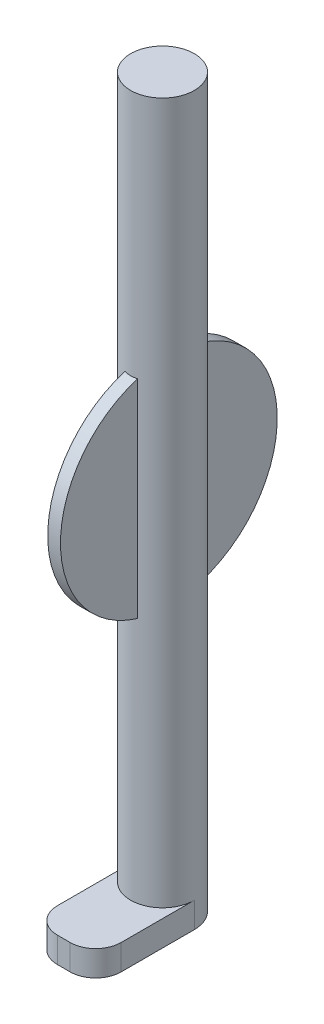
ISO-10303-21;
HEADER;
FILE_DESCRIPTION(('STEP AP214'),'2;1');
FILE_NAME('part.step','',(''),(''),'','','');
FILE_SCHEMA(('AUTOMOTIVE_DESIGN { 1 0 10303 214 1 1 1 1 }'));
ENDSEC;
DATA;
#1=APPLICATION_CONTEXT('core data for automotive mechanical design processes');
#2=APPLICATION_PROTOCOL_DEFINITION('international standard','automotive_design',2000,#1);
#3=PRODUCT_CONTEXT('',#1,'mechanical');
#4=PRODUCT('Part','Part','',(#3));
#5=PRODUCT_RELATED_PRODUCT_CATEGORY('part','',(#4));
#6=PRODUCT_DEFINITION_FORMATION('','',#4);
#7=PRODUCT_DEFINITION_CONTEXT('part definition',#1,'design');
#8=PRODUCT_DEFINITION('design','',#6,#7);
#9=PRODUCT_DEFINITION_SHAPE('','',#8);
#10=(LENGTH_UNIT() NAMED_UNIT(*) SI_UNIT(.MILLI.,.METRE.));
#11=(NAMED_UNIT(*) PLANE_ANGLE_UNIT() SI_UNIT($,.RADIAN.));
#12=(NAMED_UNIT(*) SI_UNIT($,.STERADIAN.) SOLID_ANGLE_UNIT());
#13=UNCERTAINTY_MEASURE_WITH_UNIT(LENGTH_MEASURE(1.E-05),#10,'distance_accuracy_value','');
#14=(GEOMETRIC_REPRESENTATION_CONTEXT(3) GLOBAL_UNCERTAINTY_ASSIGNED_CONTEXT((#13)) GLOBAL_UNIT_ASSIGNED_CONTEXT((#10,
#11,#12)) REPRESENTATION_CONTEXT('',''));
#15=CARTESIAN_POINT('',(0.,0.,0.));
#16=DIRECTION('',(0.,0.,1.));
#17=DIRECTION('',(1.,0.,0.));
#18=AXIS2_PLACEMENT_3D('',#15,#16,#17);
#19=CARTESIAN_POINT('',(0.,55.,0.));
#20=DIRECTION('',(0.,-1.,0.));
#21=DIRECTION('',(0.,0.,-1.));
#22=AXIS2_PLACEMENT_3D('',#19,#20,#21);
#23=CYLINDRICAL_SURFACE('',#22,2.5);
#24=DIRECTION('',(0.,-1.,0.));
#25=VECTOR('',#24,1.);
#26=CARTESIAN_POINT('',(-0.5,55.,-2.44948974278318));
#27=LINE('',#26,#25);
#28=CARTESIAN_POINT('',(-0.5,19.3605897019501,-2.44948974278318));
#29=VERTEX_POINT('',#28);
#30=CARTESIAN_POINT('',(-0.5,35.6394102980499,-2.44948974278318));
#31=VERTEX_POINT('',#30);
#32=EDGE_CURVE('E213',#29,#31,#27,.F.);
#33=ORIENTED_EDGE('',*,*,#32,.F.);
#34=CARTESIAN_POINT('',(0.,19.375961595364,-2.5));
#35=CARTESIAN_POINT('',(0.137126147164807,19.3759599523077,-2.49999796236332));
#36=CARTESIAN_POINT('',(0.2742725772205,19.3724517650998,-2.48867946345813));
#37=CARTESIAN_POINT('',(0.544564816931385,19.3588514629897,-2.44381537502387));
#38=CARTESIAN_POINT('',(0.677709151405955,19.3487569507454,-2.41026169208832));
#39=CARTESIAN_POINT('',(0.936045836237619,19.3232240271243,-2.32215786618519));
#40=CARTESIAN_POINT('',(1.06125065146262,19.3077942508059,-2.26764163496267));
#41=CARTESIAN_POINT('',(1.30076603295632,19.2733409037312,-2.13927079722776));
#42=CARTESIAN_POINT('',(1.41507510430714,19.2543168408963,-2.06541354228249));
#43=CARTESIAN_POINT('',(1.63303109178047,19.2141695567546,-1.89805242493169));
#44=CARTESIAN_POINT('',(1.736297582944,19.1930029477946,-1.80406342823792));
#45=CARTESIAN_POINT('',(1.92585344481319,19.151326842127,-1.60014717785515));
#46=CARTESIAN_POINT('',(2.01214071585728,19.1308174269504,-1.49021795590314));
#47=CARTESIAN_POINT('',(2.16692855677449,19.0922753130273,-1.25484804530034));
#48=CARTESIAN_POINT('',(2.23504302331761,19.0742997090688,-1.12914327438481));
#49=CARTESIAN_POINT('',(2.34901988239022,19.0433535128481,-0.867445637031227));
#50=CARTESIAN_POINT('',(2.39488687848409,19.0303818852505,-0.731454905756561));
#51=CARTESIAN_POINT('',(2.46181297512718,19.0112121482865,-0.45702400583845));
#52=CARTESIAN_POINT('',(2.48352102784736,19.0048371902868,-0.318754673888341));
#53=CARTESIAN_POINT('',(2.50356312611636,18.9989571048612,-0.0403993943316255));
#54=CARTESIAN_POINT('',(2.50190189675216,18.9994505886894,0.0996861803221896));
#55=CARTESIAN_POINT('',(2.47569214141496,19.0071259307158,0.373151342435312));
#56=CARTESIAN_POINT('',(2.45184606102945,19.0141025051135,0.506604918733647));
#57=CARTESIAN_POINT('',(2.38308861809746,19.0337119911165,0.767524842762461));
#58=CARTESIAN_POINT('',(2.3381759421864,19.0463452553773,0.894990816659903));
#59=CARTESIAN_POINT('',(2.22807324939298,19.0761362193064,1.14200961129054));
#60=CARTESIAN_POINT('',(2.16265872076083,19.0933436768076,1.26145611323968));
#61=CARTESIAN_POINT('',(2.01358574381612,19.1304524070814,1.48790420805442));
#62=CARTESIAN_POINT('',(1.92992310290204,19.1503542985153,1.59490293229939));
#63=CARTESIAN_POINT('',(1.74306936032478,19.1915886776925,1.79761108283251));
#64=CARTESIAN_POINT('',(1.63926876644528,19.212946846908,1.89275419933163));
#65=CARTESIAN_POINT('',(1.41697443540832,19.2540370182653,2.06443893360174));
#66=CARTESIAN_POINT('',(1.29847935501809,19.2737688714697,2.14097884894606));
#67=CARTESIAN_POINT('',(1.04871784710496,19.309491683028,2.27384467334688));
#68=CARTESIAN_POINT('',(0.91734712527496,19.3254477785804,2.32998458403206));
#69=CARTESIAN_POINT('',(0.646439497138881,19.3513960138771,2.41918075403472));
#70=CARTESIAN_POINT('',(0.506905148346237,19.3613900105671,2.45224420125603));
#71=CARTESIAN_POINT('',(0.229004007824919,19.373877085009,2.49330571013838));
#72=CARTESIAN_POINT('',(0.0907753960252166,19.3766267660525,2.50216167789634));
#73=CARTESIAN_POINT('',(-0.185194778369791,19.3750220862801,2.49694674077672));
#74=CARTESIAN_POINT('',(-0.322936403542723,19.370668674122,2.48287889750257));
#75=CARTESIAN_POINT('',(-0.590495744732526,19.3555994684947,2.43297838264223));
#76=CARTESIAN_POINT('',(-0.720425118724463,19.3450433190186,2.39769132906183));
#77=CARTESIAN_POINT('',(-0.972512602256212,19.3189217231529,2.30698314161101));
#78=CARTESIAN_POINT('',(-1.09466954084263,19.3033555241063,2.25155898239259));
#79=CARTESIAN_POINT('',(-1.33125222631923,19.2684648313811,2.12050182351162));
#80=CARTESIAN_POINT('',(-1.44539473754603,19.2490532188177,2.04438129566145));
#81=CARTESIAN_POINT('',(-1.65959995624599,19.2088492104373,1.87467572806313));
#82=CARTESIAN_POINT('',(-1.75965941696733,19.188056497838,1.78108667259488));
#83=CARTESIAN_POINT('',(-1.94657515707877,19.1465253194381,1.57507916378059));
#84=CARTESIAN_POINT('',(-2.03282496206256,19.1258158666673,1.46210326579578));
#85=CARTESIAN_POINT('',(-2.18515281989699,19.0875425224091,1.22279215701974));
#86=CARTESIAN_POINT('',(-2.25123190054355,19.0699784706673,1.0964576273572));
#87=CARTESIAN_POINT('',(-2.36070652456102,19.0400844051619,0.834869700798008));
#88=CARTESIAN_POINT('',(-2.40427287272618,19.0277151170737,0.699692499333716));
#89=CARTESIAN_POINT('',(-2.46793605303548,19.0094307649756,0.423508369003449));
#90=CARTESIAN_POINT('',(-2.48803931580861,19.0035139325427,0.282503048450325));
#91=CARTESIAN_POINT('',(-2.50373214990651,18.9989044200641,0.00428063265452654));
#92=CARTESIAN_POINT('',(-2.50020294498525,18.9999520341367,-0.132883087997761));
#93=CARTESIAN_POINT('',(-2.47082648153114,19.0085461617359,-0.404579879027505));
#94=CARTESIAN_POINT('',(-2.4449804049082,19.0160923310966,-0.539113088331973));
#95=CARTESIAN_POINT('',(-2.37224139343081,19.0367655647524,-0.8004300620716));
#96=CARTESIAN_POINT('',(-2.325560861568,19.0498362383085,-0.92727771497263));
#97=CARTESIAN_POINT('',(-2.21266745409868,19.0802047738536,-1.17140848295971));
#98=CARTESIAN_POINT('',(-2.1464514420796,19.0975033145483,-1.28869005835388));
#99=CARTESIAN_POINT('',(-1.9939784527005,19.1351726493757,-1.51431862183009));
#100=CARTESIAN_POINT('',(-1.90716266730101,19.1556222064547,-1.6222747375242));
#101=CARTESIAN_POINT('',(-1.71697053423111,19.1970254073248,-1.8223817825515));
#102=CARTESIAN_POINT('',(-1.61358949922716,19.2179791923626,-1.91452822302222));
#103=CARTESIAN_POINT('',(-1.38968670721729,19.2587142479691,-2.08301441277003));
#104=CARTESIAN_POINT('',(-1.26876250993104,19.2784455223777,-2.1588327454279));
#105=CARTESIAN_POINT('',(-1.01532212732722,19.313719683219,-2.28897091376096));
#106=CARTESIAN_POINT('',(-0.882811943832912,19.3292647213946,-2.34330180082886));
#107=CARTESIAN_POINT('',(-0.626106943864921,19.3527519151368,-2.42360986971079));
#108=CARTESIAN_POINT('',(-0.502780757797447,19.3613755778767,-2.45217950771625));
#109=CARTESIAN_POINT('',(-0.252975082965178,19.372980663096,-2.49037379107052));
#110=CARTESIAN_POINT('',(-0.126496171547739,19.3759631110511,-2.50000187967973));
#111=CARTESIAN_POINT('',(0.,19.375961595364,-2.5));
#112=B_SPLINE_CURVE_WITH_KNOTS('',3,(#34,#35,#36,#37,#38,#39,#40,#41,#42,#43,#44,#45,#46,#47,
#48,#49,#50,#51,#52,#53,#54,#55,#56,#57,#58,#59,#60,#61,#62,#63,#64,#65,#66,#67,#68,#69,#70,#71,
#72,#73,#74,#75,#76,#77,#78,#79,#80,#81,#82,#83,#84,#85,#86,#87,#88,#89,#90,#91,#92,#93,#94,#95,
#96,#97,#98,#99,#100,#101,#102,#103,#104,#105,#106,#107,#108,#109,#110,#111),.UNSPECIFIED.,.T.,
.F.,(4,2,2,2,2,2,2,2,2,2,2,2,2,2,2,2,2,2,2,2,2,2,2,2,2,2,2,2,2,2,2,2,2,2,2,2,2,2,4),(0.,
0.410912099878095,0.821973850269873,1.23237339254286,1.64282916164919,2.06459109250964,
2.48640514599761,2.91657307890349,3.34665196116877,3.76487622839166,4.1830159351379,
4.58835076674874,4.99371087169739,5.40367496479819,5.81373334874934,6.23900922160109,
6.66432399789825,7.09342468655064,7.52239165832584,7.93594602558847,8.34944516487446,
8.75274111013304,9.15609767062928,9.56993137756289,9.98386033532175,10.4127208011549,
10.8415594108246,11.2670947877504,11.6925135089525,12.1021596149396,12.5117840272457,
12.9173245470081,13.3229302115836,13.7411394840136,14.1594673033652,14.5896395325794,
15.0195902276005,15.3987174767159,15.7777758003975),.UNSPECIFIED.);
#113=CARTESIAN_POINT('',(0.5,19.3605897019501,-2.44948974278318));
#114=VERTEX_POINT('',#113);
#115=EDGE_CURVE('E170',#29,#114,#112,.T.);
#116=ORIENTED_EDGE('',*,*,#115,.T.);
#117=DIRECTION('',(0.,-1.,0.));
#118=VECTOR('',#117,1.);
#119=CARTESIAN_POINT('',(0.5,55.,-2.44948974278318));
#120=LINE('',#119,#118);
#121=CARTESIAN_POINT('',(0.5,35.6394102980499,-2.44948974278318));
#122=VERTEX_POINT('',#121);
#123=EDGE_CURVE('E164',#114,#122,#120,.F.);
#124=ORIENTED_EDGE('',*,*,#123,.T.);
#125=CARTESIAN_POINT('',(0.,35.624038404636,-2.5));
#126=CARTESIAN_POINT('',(-0.137126147164807,35.6240400476923,-2.49999796236332));
#127=CARTESIAN_POINT('',(-0.2742725772205,35.6275482349002,-2.48867946345813));
#128=CARTESIAN_POINT('',(-0.544564816931385,35.6411485370103,-2.44381537502387));
#129=CARTESIAN_POINT('',(-0.677709151405954,35.6512430492546,-2.41026169208832));
#130=CARTESIAN_POINT('',(-0.936045836237619,35.6767759728757,-2.32215786618519));
#131=CARTESIAN_POINT('',(-1.06125065146262,35.6922057491941,-2.26764163496267));
#132=CARTESIAN_POINT('',(-1.30076603295632,35.7266590962688,-2.13927079722776));
#133=CARTESIAN_POINT('',(-1.41507510430714,35.7456831591037,-2.06541354228249));
#134=CARTESIAN_POINT('',(-1.63303109178047,35.7858304432455,-1.89805242493169));
#135=CARTESIAN_POINT('',(-1.736297582944,35.8069970522054,-1.80406342823792));
#136=CARTESIAN_POINT('',(-1.92585344481319,35.848673157873,-1.60014717785515));
#137=CARTESIAN_POINT('',(-2.01214071585728,35.8691825730496,-1.49021795590314));
#138=CARTESIAN_POINT('',(-2.16692855677449,35.9077246869727,-1.25484804530034));
#139=CARTESIAN_POINT('',(-2.23504302331761,35.9257002909312,-1.12914327438482));
#140=CARTESIAN_POINT('',(-2.34901988239022,35.9566464871519,-0.867445637031227));
#141=CARTESIAN_POINT('',(-2.39488687848409,35.9696181147495,-0.731454905756561));
#142=CARTESIAN_POINT('',(-2.46181297512718,35.9887878517135,-0.45702400583845));
#143=CARTESIAN_POINT('',(-2.48352102784736,35.9951628097132,-0.31875467388834));
#144=CARTESIAN_POINT('',(-2.50356312611636,36.0010428951388,-0.0403993943316249));
#145=CARTESIAN_POINT('',(-2.50190189675216,36.0005494113106,0.0996861803221902));
#146=CARTESIAN_POINT('',(-2.47569214141496,35.9928740692842,0.373151342435312));
#147=CARTESIAN_POINT('',(-2.45184606102944,35.9858974948865,0.506604918733647));
#148=CARTESIAN_POINT('',(-2.38308861809746,35.9662880088835,0.767524842762461));
#149=CARTESIAN_POINT('',(-2.3381759421864,35.9536547446227,0.894990816659903));
#150=CARTESIAN_POINT('',(-2.22807324939298,35.9238637806936,1.14200961129054));
#151=CARTESIAN_POINT('',(-2.16265872076083,35.9066563231924,1.26145611323968));
#152=CARTESIAN_POINT('',(-2.01358574381612,35.8695475929186,1.48790420805442));
#153=CARTESIAN_POINT('',(-1.92992310290204,35.8496457014847,1.59490293229939));
#154=CARTESIAN_POINT('',(-1.74306936032478,35.8084113223075,1.79761108283251));
#155=CARTESIAN_POINT('',(-1.63926876644528,35.787053153092,1.89275419933163));
#156=CARTESIAN_POINT('',(-1.41697443540832,35.7459629817347,2.06443893360174));
#157=CARTESIAN_POINT('',(-1.29847935501809,35.7262311285303,2.14097884894606));
#158=CARTESIAN_POINT('',(-1.04871784710496,35.690508316972,2.27384467334688));
#159=CARTESIAN_POINT('',(-0.917347125274959,35.6745522214196,2.32998458403206));
#160=CARTESIAN_POINT('',(-0.64643949713888,35.6486039861229,2.41918075403472));
#161=CARTESIAN_POINT('',(-0.506905148346235,35.6386099894329,2.45224420125603));
#162=CARTESIAN_POINT('',(-0.229004007824918,35.626122914991,2.49330571013838));
#163=CARTESIAN_POINT('',(-0.0907753960252156,35.6233732339475,2.50216167789634));
#164=CARTESIAN_POINT('',(0.185194778369792,35.6249779137199,2.49694674077672));
#165=CARTESIAN_POINT('',(0.322936403542724,35.629331325878,2.48287889750257));
#166=CARTESIAN_POINT('',(0.590495744732527,35.6444005315053,2.43297838264223));
#167=CARTESIAN_POINT('',(0.720425118724463,35.6549566809814,2.39769132906183));
#168=CARTESIAN_POINT('',(0.972512602256212,35.6810782768471,2.30698314161101));
#169=CARTESIAN_POINT('',(1.09466954084263,35.6966444758936,2.25155898239259));
#170=CARTESIAN_POINT('',(1.33125222631923,35.7315351686189,2.12050182351162));
#171=CARTESIAN_POINT('',(1.44539473754603,35.7509467811823,2.04438129566145));
#172=CARTESIAN_POINT('',(1.65959995624599,35.7911507895627,1.87467572806313));
#173=CARTESIAN_POINT('',(1.75965941696733,35.811943502162,1.78108667259488));
#174=CARTESIAN_POINT('',(1.94657515707877,35.8534746805619,1.57507916378059));
#175=CARTESIAN_POINT('',(2.03282496206256,35.8741841333327,1.46210326579578));
#176=CARTESIAN_POINT('',(2.18515281989699,35.9124574775909,1.22279215701974));
#177=CARTESIAN_POINT('',(2.25123190054355,35.9300215293327,1.0964576273572));
#178=CARTESIAN_POINT('',(2.36070652456102,35.9599155948381,0.834869700798008));
#179=CARTESIAN_POINT('',(2.40427287272618,35.9722848829264,0.699692499333716));
#180=CARTESIAN_POINT('',(2.46793605303548,35.9905692350244,0.423508369003448));
#181=CARTESIAN_POINT('',(2.48803931580861,35.9964860674573,0.282503048450324));
#182=CARTESIAN_POINT('',(2.50373214990651,36.0010955799359,0.00428063265452513));
#183=CARTESIAN_POINT('',(2.50020294498525,36.0000479658633,-0.132883087997763));
#184=CARTESIAN_POINT('',(2.47082648153114,35.9914538382641,-0.404579879027507));
#185=CARTESIAN_POINT('',(2.4449804049082,35.9839076689034,-0.539113088331975));
#186=CARTESIAN_POINT('',(2.37224139343081,35.9632344352476,-0.800430062071602));
#187=CARTESIAN_POINT('',(2.325560861568,35.9501637616915,-0.927277714972633));
#188=CARTESIAN_POINT('',(2.21266745409868,35.9197952261463,-1.17140848295972));
#189=CARTESIAN_POINT('',(2.1464514420796,35.9024966854517,-1.28869005835389));
#190=CARTESIAN_POINT('',(1.9939784527005,35.8648273506244,-1.51431862183009));
#191=CARTESIAN_POINT('',(1.90716266730101,35.8443777935453,-1.6222747375242));
#192=CARTESIAN_POINT('',(1.71697053423111,35.8029745926752,-1.82238178255151));
#193=CARTESIAN_POINT('',(1.61358949922716,35.7820208076374,-1.91452822302223));
#194=CARTESIAN_POINT('',(1.38968670721729,35.7412857520309,-2.08301441277003));
#195=CARTESIAN_POINT('',(1.26876250993104,35.7215544776223,-2.1588327454279));
#196=CARTESIAN_POINT('',(1.01532212732722,35.686280316781,-2.28897091376096));
#197=CARTESIAN_POINT('',(0.882811943832911,35.6707352786054,-2.34330180082887));
#198=CARTESIAN_POINT('',(0.626106943864921,35.6472480848632,-2.42360986971079));
#199=CARTESIAN_POINT('',(0.502780757797447,35.6386244221233,-2.45217950771625));
#200=CARTESIAN_POINT('',(0.252975082965179,35.627019336904,-2.49037379107052));
#201=CARTESIAN_POINT('',(0.126496171547739,35.6240368889489,-2.50000187967973));
#202=CARTESIAN_POINT('',(0.,35.624038404636,-2.5));
#203=B_SPLINE_CURVE_WITH_KNOTS('',3,(#125,#126,#127,#128,#129,#130,#131,#132,#133,#134,#135,
#136,#137,#138,#139,#140,#141,#142,#143,#144,#145,#146,#147,#148,#149,#150,#151,#152,#153,#154,
#155,#156,#157,#158,#159,#160,#161,#162,#163,#164,#165,#166,#167,#168,#169,#170,#171,#172,#173,
#174,#175,#176,#177,#178,#179,#180,#181,#182,#183,#184,#185,#186,#187,#188,#189,#190,#191,#192,
#193,#194,#195,#196,#197,#198,#199,#200,#201,#202),.UNSPECIFIED.,.T.,.F.,(4,2,2,2,2,2,2,2,2,2,2,
2,2,2,2,2,2,2,2,2,2,2,2,2,2,2,2,2,2,2,2,2,2,2,2,2,2,2,4),(0.,0.410912099878095,
0.821973850269873,1.23237339254286,1.64282916164919,2.06459109250964,2.48640514599761,
2.91657307890349,3.34665196116877,3.76487622839166,4.1830159351379,4.58835076674874,
4.99371087169739,5.40367496479819,5.81373334874934,6.23900922160109,6.66432399789825,
7.09342468655064,7.52239165832584,7.93594602558847,8.34944516487446,8.75274111013304,
9.15609767062928,9.56993137756289,9.98386033532175,10.4127208011549,10.8415594108246,
11.2670947877504,11.6925135089525,12.1021596149396,12.5117840272457,12.9173245470081,
13.3229302115836,13.7411394840136,14.1594673033652,14.5896395325794,15.0195902276005,
15.3987174767158,15.7777758003975),.UNSPECIFIED.);
#204=EDGE_CURVE('E179',#122,#31,#203,.T.);
#205=ORIENTED_EDGE('',*,*,#204,.T.);
#206=EDGE_LOOP('',(#33,#116,#124,#205));
#207=FACE_BOUND('',#206,.T.);
#208=CARTESIAN_POINT('',(0.,55.,0.));
#209=DIRECTION('',(0.,1.,0.));
#210=DIRECTION('',(0.,0.,1.));
#211=AXIS2_PLACEMENT_3D('',#208,#209,#210);
#212=CIRCLE('',#211,2.5);
#213=CARTESIAN_POINT('',(0.,55.,2.5));
#214=VERTEX_POINT('',#213);
#215=EDGE_CURVE('E160',#214,#214,#212,.T.);
#216=ORIENTED_EDGE('',*,*,#215,.F.);
#217=EDGE_LOOP('',(#216));
#218=FACE_BOUND('',#217,.T.);
#219=CARTESIAN_POINT('',(0.,0.,0.));
#220=DIRECTION('',(0.,1.,0.));
#221=DIRECTION('',(0.,0.,1.));
#222=AXIS2_PLACEMENT_3D('',#219,#220,#221);
#223=CIRCLE('',#222,2.5);
#224=CARTESIAN_POINT('',(-2.5,0.,0.));
#225=VERTEX_POINT('',#224);
#226=CARTESIAN_POINT('',(2.5,0.,0.));
#227=VERTEX_POINT('',#226);
#228=EDGE_CURVE('E143',#225,#227,#223,.T.);
#229=ORIENTED_EDGE('',*,*,#228,.T.);
#230=DIRECTION('',(0.,1.,0.));
#231=VECTOR('',#230,1.);
#232=CARTESIAN_POINT('',(2.5,-2.,0.));
#233=LINE('',#232,#231);
#234=CARTESIAN_POINT('',(2.5,-2.,0.));
#235=VERTEX_POINT('',#234);
#236=EDGE_CURVE('E122',#235,#227,#233,.T.);
#237=ORIENTED_EDGE('',*,*,#236,.F.);
#238=CARTESIAN_POINT('',(0.,-2.,0.));
#239=DIRECTION('',(0.,-1.,0.));
#240=DIRECTION('',(0.,0.,-1.));
#241=AXIS2_PLACEMENT_3D('',#238,#239,#240);
#242=CIRCLE('',#241,2.5);
#243=CARTESIAN_POINT('',(-2.5,-2.,0.));
#244=VERTEX_POINT('',#243);
#245=EDGE_CURVE('E128',#244,#235,#242,.T.);
#246=ORIENTED_EDGE('',*,*,#245,.F.);
#247=DIRECTION('',(0.,1.,0.));
#248=VECTOR('',#247,1.);
#249=CARTESIAN_POINT('',(-2.5,-2.,0.));
#250=LINE('',#249,#248);
#251=EDGE_CURVE('E146',#244,#225,#250,.T.);
#252=ORIENTED_EDGE('',*,*,#251,.T.);
#253=EDGE_LOOP('',(#229,#237,#246,#252));
#254=FACE_BOUND('',#253,.T.);
#255=DIRECTION('',(0.,-1.,0.));
#256=VECTOR('',#255,1.);
#257=CARTESIAN_POINT('',(-0.5,55.,2.44948974278318));
#258=LINE('',#257,#256);
#259=CARTESIAN_POINT('',(-0.5,35.6394102980499,2.44948974278318));
#260=VERTEX_POINT('',#259);
#261=CARTESIAN_POINT('',(-0.5,19.3605897019501,2.44948974278318));
#262=VERTEX_POINT('',#261);
#263=EDGE_CURVE('E224',#260,#262,#258,.T.);
#264=ORIENTED_EDGE('',*,*,#263,.F.);
#265=CARTESIAN_POINT('',(0.5,35.6394102980499,2.44948974278318));
#266=VERTEX_POINT('',#265);
#267=EDGE_CURVE('E222',#260,#266,#203,.T.);
#268=ORIENTED_EDGE('',*,*,#267,.T.);
#269=DIRECTION('',(0.,-1.,0.));
#270=VECTOR('',#269,1.);
#271=CARTESIAN_POINT('',(0.5,55.,2.44948974278318));
#272=LINE('',#271,#270);
#273=CARTESIAN_POINT('',(0.5,19.3605897019501,2.44948974278318));
#274=VERTEX_POINT('',#273);
#275=EDGE_CURVE('E217',#266,#274,#272,.T.);
#276=ORIENTED_EDGE('',*,*,#275,.T.);
#277=EDGE_CURVE('E180',#274,#262,#112,.T.);
#278=ORIENTED_EDGE('',*,*,#277,.T.);
#279=EDGE_LOOP('',(#264,#268,#276,#278));
#280=FACE_BOUND('',#279,.T.);
#281=ADVANCED_FACE('F42',(#207,#218,#254,#280),#23,.T.);
#282=CARTESIAN_POINT('',(0.,55.,0.));
#283=DIRECTION('',(0.,1.,0.));
#284=DIRECTION('',(0.,0.,1.));
#285=AXIS2_PLACEMENT_3D('',#282,#283,#284);
#286=PLANE('',#285);
#287=ORIENTED_EDGE('',*,*,#215,.T.);
#288=EDGE_LOOP('',(#287));
#289=FACE_BOUND('',#288,.T.);
#290=ADVANCED_FACE('F195',(#289),#286,.T.);
#291=CARTESIAN_POINT('',(-0.5,27.5,0.));
#292=DIRECTION('',(1.,0.,0.));
#293=DIRECTION('',(0.,0.,-1.));
#294=AXIS2_PLACEMENT_3D('',#291,#292,#293);
#295=PLANE('',#294);
#296=CARTESIAN_POINT('',(-0.5,27.5,0.));
#297=DIRECTION('',(1.,0.,0.));
#298=DIRECTION('',(0.,0.,-1.));
#299=AXIS2_PLACEMENT_3D('',#296,#297,#298);
#300=CIRCLE('',#299,8.5);
#301=EDGE_CURVE('E155',#29,#31,#300,.T.);
#302=ORIENTED_EDGE('',*,*,#301,.F.);
#303=ORIENTED_EDGE('',*,*,#32,.T.);
#304=EDGE_LOOP('',(#302,#303));
#305=FACE_BOUND('',#304,.T.);
#306=ADVANCED_FACE('F198',(#305),#295,.F.);
#307=CARTESIAN_POINT('',(0.5,27.5,0.));
#308=DIRECTION('',(1.,0.,0.));
#309=DIRECTION('',(0.,0.,-1.));
#310=AXIS2_PLACEMENT_3D('',#307,#308,#309);
#311=PLANE('',#310);
#312=ORIENTED_EDGE('',*,*,#123,.F.);
#313=CARTESIAN_POINT('',(0.5,27.5,0.));
#314=DIRECTION('',(1.,0.,0.));
#315=DIRECTION('',(0.,0.,-1.));
#316=AXIS2_PLACEMENT_3D('',#313,#314,#315);
#317=CIRCLE('',#316,8.5);
#318=EDGE_CURVE('E145',#114,#122,#317,.T.);
#319=ORIENTED_EDGE('',*,*,#318,.T.);
#320=EDGE_LOOP('',(#312,#319));
#321=FACE_BOUND('',#320,.T.);
#322=ADVANCED_FACE('F204',(#321),#311,.T.);
#323=CARTESIAN_POINT('',(-0.5,27.5,0.));
#324=DIRECTION('',(1.,0.,0.));
#325=DIRECTION('',(0.,0.,-1.));
#326=AXIS2_PLACEMENT_3D('',#323,#324,#325);
#327=CYLINDRICAL_SURFACE('',#326,8.5);
#328=ORIENTED_EDGE('',*,*,#204,.F.);
#329=ORIENTED_EDGE('',*,*,#318,.F.);
#330=ORIENTED_EDGE('',*,*,#115,.F.);
#331=ORIENTED_EDGE('',*,*,#301,.T.);
#332=EDGE_LOOP('',(#328,#329,#330,#331));
#333=FACE_BOUND('',#332,.T.);
#334=ADVANCED_FACE('F192',(#333),#327,.T.);
#335=ORIENTED_EDGE('',*,*,#267,.F.);
#336=EDGE_CURVE('E159',#260,#262,#300,.T.);
#337=ORIENTED_EDGE('',*,*,#336,.T.);
#338=ORIENTED_EDGE('',*,*,#277,.F.);
#339=EDGE_CURVE('E150',#266,#274,#317,.T.);
#340=ORIENTED_EDGE('',*,*,#339,.F.);
#341=EDGE_LOOP('',(#335,#337,#338,#340));
#342=FACE_BOUND('',#341,.T.);
#343=ADVANCED_FACE('F187',(#342),#327,.T.);
#344=ORIENTED_EDGE('',*,*,#336,.F.);
#345=ORIENTED_EDGE('',*,*,#263,.T.);
#346=EDGE_LOOP('',(#344,#345));
#347=FACE_BOUND('',#346,.T.);
#348=ADVANCED_FACE('F191',(#347),#295,.F.);
#349=ORIENTED_EDGE('',*,*,#275,.F.);
#350=ORIENTED_EDGE('',*,*,#339,.T.);
#351=EDGE_LOOP('',(#349,#350));
#352=FACE_BOUND('',#351,.T.);
#353=ADVANCED_FACE('F288',(#352),#311,.T.);
#354=CARTESIAN_POINT('',(2.5,-2.,0.));
#355=DIRECTION('',(-1.,0.,0.));
#356=DIRECTION('',(0.,0.,1.));
#357=AXIS2_PLACEMENT_3D('',#354,#355,#356);
#358=PLANE('',#357);
#359=DIRECTION('',(0.,0.,1.));
#360=VECTOR('',#359,1.);
#361=CARTESIAN_POINT('',(2.5,0.,0.));
#362=LINE('',#361,#360);
#363=CARTESIAN_POINT('',(2.5,0.,5.74256528464534));
#364=VERTEX_POINT('',#363);
#365=EDGE_CURVE('E262',#227,#364,#362,.T.);
#366=ORIENTED_EDGE('',*,*,#365,.T.);
#367=DIRECTION('',(0.,1.,0.));
#368=VECTOR('',#367,1.);
#369=CARTESIAN_POINT('',(2.5,-2.,5.74256528464534));
#370=LINE('',#369,#368);
#371=CARTESIAN_POINT('',(2.5,-2.,5.74256528464534));
#372=VERTEX_POINT('',#371);
#373=EDGE_CURVE('E11',#364,#372,#370,.F.);
#374=ORIENTED_EDGE('',*,*,#373,.T.);
#375=DIRECTION('',(0.,0.,1.));
#376=VECTOR('',#375,1.);
#377=CARTESIAN_POINT('',(2.5,-2.,0.));
#378=LINE('',#377,#376);
#379=EDGE_CURVE('E118',#235,#372,#378,.T.);
#380=ORIENTED_EDGE('',*,*,#379,.F.);
#381=ORIENTED_EDGE('',*,*,#236,.T.);
#382=EDGE_LOOP('',(#366,#374,#380,#381));
#383=FACE_BOUND('',#382,.T.);
#384=ADVANCED_FACE('F120',(#383),#358,.F.);
#385=CARTESIAN_POINT('',(-2.5,-2.,7.74256528464534));
#386=DIRECTION('',(0.,0.,-1.));
#387=DIRECTION('',(-1.,0.,0.));
#388=AXIS2_PLACEMENT_3D('',#385,#386,#387);
#389=PLANE('',#388);
#390=DIRECTION('',(-1.,0.,0.));
#391=VECTOR('',#390,1.);
#392=CARTESIAN_POINT('',(-2.5,0.,7.74256528464534));
#393=LINE('',#392,#391);
#394=CARTESIAN_POINT('',(0.5,0.,7.74256528464534));
#395=VERTEX_POINT('',#394);
#396=CARTESIAN_POINT('',(-0.5,0.,7.74256528464534));
#397=VERTEX_POINT('',#396);
#398=EDGE_CURVE('E258',#395,#397,#393,.T.);
#399=ORIENTED_EDGE('',*,*,#398,.T.);
#400=DIRECTION('',(0.,1.,0.));
#401=VECTOR('',#400,1.);
#402=CARTESIAN_POINT('',(-0.5,-2.,7.74256528464534));
#403=LINE('',#402,#401);
#404=CARTESIAN_POINT('',(-0.5,-2.,7.74256528464534));
#405=VERTEX_POINT('',#404);
#406=EDGE_CURVE('E64',#397,#405,#403,.F.);
#407=ORIENTED_EDGE('',*,*,#406,.T.);
#408=DIRECTION('',(-1.,0.,0.));
#409=VECTOR('',#408,1.);
#410=CARTESIAN_POINT('',(-2.5,-2.,7.74256528464534));
#411=LINE('',#410,#409);
#412=CARTESIAN_POINT('',(0.5,-2.,7.74256528464534));
#413=VERTEX_POINT('',#412);
#414=EDGE_CURVE('E127',#413,#405,#411,.T.);
#415=ORIENTED_EDGE('',*,*,#414,.F.);
#416=DIRECTION('',(0.,1.,0.));
#417=VECTOR('',#416,1.);
#418=CARTESIAN_POINT('',(0.5,-2.,7.74256528464534));
#419=LINE('',#418,#417);
#420=EDGE_CURVE('E237',#413,#395,#419,.T.);
#421=ORIENTED_EDGE('',*,*,#420,.T.);
#422=EDGE_LOOP('',(#399,#407,#415,#421));
#423=FACE_BOUND('',#422,.T.);
#424=ADVANCED_FACE('F259',(#423),#389,.F.);
#425=CARTESIAN_POINT('',(-2.5,-2.,0.));
#426=DIRECTION('',(1.,0.,0.));
#427=DIRECTION('',(0.,0.,-1.));
#428=AXIS2_PLACEMENT_3D('',#425,#426,#427);
#429=PLANE('',#428);
#430=DIRECTION('',(0.,0.,-1.));
#431=VECTOR('',#430,1.);
#432=CARTESIAN_POINT('',(-2.5,-2.,0.));
#433=LINE('',#432,#431);
#434=CARTESIAN_POINT('',(-2.5,-2.,5.74256528464534));
#435=VERTEX_POINT('',#434);
#436=EDGE_CURVE('E133',#435,#244,#433,.T.);
#437=ORIENTED_EDGE('',*,*,#436,.F.);
#438=DIRECTION('',(0.,1.,0.));
#439=VECTOR('',#438,1.);
#440=CARTESIAN_POINT('',(-2.5,-2.,5.74256528464534));
#441=LINE('',#440,#439);
#442=CARTESIAN_POINT('',(-2.5,0.,5.74256528464534));
#443=VERTEX_POINT('',#442);
#444=EDGE_CURVE('E227',#435,#443,#441,.T.);
#445=ORIENTED_EDGE('',*,*,#444,.T.);
#446=DIRECTION('',(0.,0.,-1.));
#447=VECTOR('',#446,1.);
#448=CARTESIAN_POINT('',(-2.5,0.,0.));
#449=LINE('',#448,#447);
#450=EDGE_CURVE('E138',#443,#225,#449,.T.);
#451=ORIENTED_EDGE('',*,*,#450,.T.);
#452=ORIENTED_EDGE('',*,*,#251,.F.);
#453=EDGE_LOOP('',(#437,#445,#451,#452));
#454=FACE_BOUND('',#453,.T.);
#455=ADVANCED_FACE('F250',(#454),#429,.F.);
#456=CARTESIAN_POINT('',(0.,-2.,0.));
#457=DIRECTION('',(0.,-1.,0.));
#458=DIRECTION('',(0.,0.,-1.));
#459=AXIS2_PLACEMENT_3D('',#456,#457,#458);
#460=PLANE('',#459);
#461=ORIENTED_EDGE('',*,*,#414,.T.);
#462=CARTESIAN_POINT('',(-0.5,-2.,5.74256528464534));
#463=DIRECTION('',(0.,-1.,0.));
#464=DIRECTION('',(0.,0.,-1.));
#465=AXIS2_PLACEMENT_3D('',#462,#463,#464);
#466=CIRCLE('',#465,2.);
#467=EDGE_CURVE('E51',#405,#435,#466,.T.);
#468=ORIENTED_EDGE('',*,*,#467,.T.);
#469=ORIENTED_EDGE('',*,*,#436,.T.);
#470=ORIENTED_EDGE('',*,*,#245,.T.);
#471=ORIENTED_EDGE('',*,*,#379,.T.);
#472=CARTESIAN_POINT('',(0.5,-2.,5.74256528464534));
#473=DIRECTION('',(0.,-1.,0.));
#474=DIRECTION('',(0.,0.,-1.));
#475=AXIS2_PLACEMENT_3D('',#472,#473,#474);
#476=CIRCLE('',#475,2.);
#477=EDGE_CURVE('E243',#372,#413,#476,.T.);
#478=ORIENTED_EDGE('',*,*,#477,.T.);
#479=EDGE_LOOP('',(#461,#468,#469,#470,#471,#478));
#480=FACE_BOUND('',#479,.T.);
#481=ADVANCED_FACE('F131',(#480),#460,.T.);
#482=CARTESIAN_POINT('',(0.,0.,0.));
#483=DIRECTION('',(0.,-1.,0.));
#484=DIRECTION('',(0.,0.,-1.));
#485=AXIS2_PLACEMENT_3D('',#482,#483,#484);
#486=PLANE('',#485);
#487=ORIENTED_EDGE('',*,*,#450,.F.);
#488=CARTESIAN_POINT('',(-0.5,0.,5.74256528464534));
#489=DIRECTION('',(0.,-1.,0.));
#490=DIRECTION('',(0.,0.,-1.));
#491=AXIS2_PLACEMENT_3D('',#488,#489,#490);
#492=CIRCLE('',#491,2.);
#493=EDGE_CURVE('E234',#443,#397,#492,.F.);
#494=ORIENTED_EDGE('',*,*,#493,.T.);
#495=ORIENTED_EDGE('',*,*,#398,.F.);
#496=CARTESIAN_POINT('',(0.5,0.,5.74256528464534));
#497=DIRECTION('',(0.,-1.,0.));
#498=DIRECTION('',(0.,0.,-1.));
#499=AXIS2_PLACEMENT_3D('',#496,#497,#498);
#500=CIRCLE('',#499,2.);
#501=EDGE_CURVE('E231',#395,#364,#500,.F.);
#502=ORIENTED_EDGE('',*,*,#501,.T.);
#503=ORIENTED_EDGE('',*,*,#365,.F.);
#504=ORIENTED_EDGE('',*,*,#228,.F.);
#505=EDGE_LOOP('',(#487,#494,#495,#502,#503,#504));
#506=FACE_BOUND('',#505,.T.);
#507=ADVANCED_FACE('F257',(#506),#486,.F.);
#508=CARTESIAN_POINT('',(-0.5,-2.,5.74256528464534));
#509=DIRECTION('',(0.,1.,0.));
#510=DIRECTION('',(0.,0.,1.));
#511=AXIS2_PLACEMENT_3D('',#508,#509,#510);
#512=CYLINDRICAL_SURFACE('',#511,2.);
#513=ORIENTED_EDGE('',*,*,#467,.F.);
#514=ORIENTED_EDGE('',*,*,#406,.F.);
#515=ORIENTED_EDGE('',*,*,#493,.F.);
#516=ORIENTED_EDGE('',*,*,#444,.F.);
#517=EDGE_LOOP('',(#513,#514,#515,#516));
#518=FACE_BOUND('',#517,.T.);
#519=ADVANCED_FACE('F254',(#518),#512,.T.);
#520=CARTESIAN_POINT('',(0.5,-2.,5.74256528464534));
#521=DIRECTION('',(0.,1.,0.));
#522=DIRECTION('',(0.,0.,1.));
#523=AXIS2_PLACEMENT_3D('',#520,#521,#522);
#524=CYLINDRICAL_SURFACE('',#523,2.);
#525=ORIENTED_EDGE('',*,*,#477,.F.);
#526=ORIENTED_EDGE('',*,*,#373,.F.);
#527=ORIENTED_EDGE('',*,*,#501,.F.);
#528=ORIENTED_EDGE('',*,*,#420,.F.);
#529=EDGE_LOOP('',(#525,#526,#527,#528));
#530=FACE_BOUND('',#529,.T.);
#531=ADVANCED_FACE('F44',(#530),#524,.T.);
#532=CLOSED_SHELL('',(#281,#290,#306,#322,#334,#343,#348,#353,#384,#424,#455,#481,#507,#519,#531));
#533=MANIFOLD_SOLID_BREP('B2',#532);
#534=ADVANCED_BREP_SHAPE_REPRESENTATION('',(#18,#533),#14);
#535=SHAPE_DEFINITION_REPRESENTATION(#9,#534);
ENDSEC;
END-ISO-10303-21;
